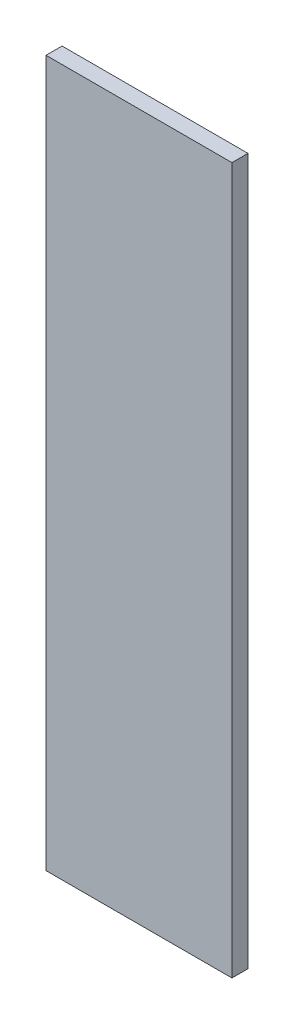
ISO-10303-21;
HEADER;
FILE_DESCRIPTION(('STEP AP214'),'2;1');
FILE_NAME('part.step','',(''),(''),'','','');
FILE_SCHEMA(('AUTOMOTIVE_DESIGN { 1 0 10303 214 1 1 1 1 }'));
ENDSEC;
DATA;
#1=APPLICATION_CONTEXT('core data for automotive mechanical design processes');
#2=APPLICATION_PROTOCOL_DEFINITION('international standard','automotive_design',2000,#1);
#3=PRODUCT_CONTEXT('',#1,'mechanical');
#4=PRODUCT('Part','Part','',(#3));
#5=PRODUCT_RELATED_PRODUCT_CATEGORY('part','',(#4));
#6=PRODUCT_DEFINITION_FORMATION('','',#4);
#7=PRODUCT_DEFINITION_CONTEXT('part definition',#1,'design');
#8=PRODUCT_DEFINITION('design','',#6,#7);
#9=PRODUCT_DEFINITION_SHAPE('','',#8);
#10=(LENGTH_UNIT() NAMED_UNIT(*) SI_UNIT(.MILLI.,.METRE.));
#11=(NAMED_UNIT(*) PLANE_ANGLE_UNIT() SI_UNIT($,.RADIAN.));
#12=(NAMED_UNIT(*) SI_UNIT($,.STERADIAN.) SOLID_ANGLE_UNIT());
#13=UNCERTAINTY_MEASURE_WITH_UNIT(LENGTH_MEASURE(1.E-05),#10,'distance_accuracy_value','');
#14=(GEOMETRIC_REPRESENTATION_CONTEXT(3) GLOBAL_UNCERTAINTY_ASSIGNED_CONTEXT((#13)) GLOBAL_UNIT_ASSIGNED_CONTEXT((#10,
#11,#12)) REPRESENTATION_CONTEXT('',''));
#15=CARTESIAN_POINT('',(0.,0.,0.));
#16=DIRECTION('',(0.,0.,1.));
#17=DIRECTION('',(1.,0.,0.));
#18=AXIS2_PLACEMENT_3D('',#15,#16,#17);
#19=CARTESIAN_POINT('',(0.,0.,19.05));
#20=DIRECTION('',(1.,0.,0.));
#21=DIRECTION('',(0.,0.,-1.));
#22=AXIS2_PLACEMENT_3D('',#19,#20,#21);
#23=PLANE('',#22);
#24=DIRECTION('',(0.,-1.,0.));
#25=VECTOR('',#24,1.);
#26=CARTESIAN_POINT('',(0.,0.,0.));
#27=LINE('',#26,#25);
#28=CARTESIAN_POINT('',(0.,838.2,0.));
#29=VERTEX_POINT('',#28);
#30=CARTESIAN_POINT('',(0.,0.,0.));
#31=VERTEX_POINT('',#30);
#32=EDGE_CURVE('E96',#29,#31,#27,.T.);
#33=ORIENTED_EDGE('',*,*,#32,.T.);
#34=DIRECTION('',(0.,0.,-1.));
#35=VECTOR('',#34,1.);
#36=CARTESIAN_POINT('',(0.,0.,19.05));
#37=LINE('',#36,#35);
#38=CARTESIAN_POINT('',(0.,0.,19.05));
#39=VERTEX_POINT('',#38);
#40=EDGE_CURVE('E11',#39,#31,#37,.T.);
#41=ORIENTED_EDGE('',*,*,#40,.F.);
#42=DIRECTION('',(0.,-1.,0.));
#43=VECTOR('',#42,1.);
#44=CARTESIAN_POINT('',(0.,0.,19.05));
#45=LINE('',#44,#43);
#46=CARTESIAN_POINT('',(0.,838.2,19.05));
#47=VERTEX_POINT('',#46);
#48=EDGE_CURVE('E84',#47,#39,#45,.T.);
#49=ORIENTED_EDGE('',*,*,#48,.F.);
#50=DIRECTION('',(0.,0.,-1.));
#51=VECTOR('',#50,1.);
#52=CARTESIAN_POINT('',(0.,838.2,19.05));
#53=LINE('',#52,#51);
#54=EDGE_CURVE('E92',#47,#29,#53,.T.);
#55=ORIENTED_EDGE('',*,*,#54,.T.);
#56=EDGE_LOOP('',(#33,#41,#49,#55));
#57=FACE_BOUND('',#56,.T.);
#58=ADVANCED_FACE('F33',(#57),#23,.F.);
#59=CARTESIAN_POINT('',(0.,0.,19.05));
#60=DIRECTION('',(0.,1.,0.));
#61=DIRECTION('',(0.,0.,1.));
#62=AXIS2_PLACEMENT_3D('',#59,#60,#61);
#63=PLANE('',#62);
#64=DIRECTION('',(1.,0.,0.));
#65=VECTOR('',#64,1.);
#66=CARTESIAN_POINT('',(0.,0.,0.));
#67=LINE('',#66,#65);
#68=CARTESIAN_POINT('',(220.726,0.,0.));
#69=VERTEX_POINT('',#68);
#70=EDGE_CURVE('E88',#31,#69,#67,.T.);
#71=ORIENTED_EDGE('',*,*,#70,.T.);
#72=DIRECTION('',(0.,0.,-1.));
#73=VECTOR('',#72,1.);
#74=CARTESIAN_POINT('',(220.726,0.,19.05));
#75=LINE('',#74,#73);
#76=CARTESIAN_POINT('',(220.726,0.,19.05));
#77=VERTEX_POINT('',#76);
#78=EDGE_CURVE('E41',#77,#69,#75,.T.);
#79=ORIENTED_EDGE('',*,*,#78,.F.);
#80=DIRECTION('',(1.,0.,0.));
#81=VECTOR('',#80,1.);
#82=CARTESIAN_POINT('',(0.,0.,19.05));
#83=LINE('',#82,#81);
#84=EDGE_CURVE('E79',#39,#77,#83,.T.);
#85=ORIENTED_EDGE('',*,*,#84,.F.);
#86=ORIENTED_EDGE('',*,*,#40,.T.);
#87=EDGE_LOOP('',(#71,#79,#85,#86));
#88=FACE_BOUND('',#87,.T.);
#89=ADVANCED_FACE('F87',(#88),#63,.F.);
#90=CARTESIAN_POINT('',(220.726,0.,19.05));
#91=DIRECTION('',(-1.,0.,0.));
#92=DIRECTION('',(0.,0.,1.));
#93=AXIS2_PLACEMENT_3D('',#90,#91,#92);
#94=PLANE('',#93);
#95=DIRECTION('',(0.,1.,0.));
#96=VECTOR('',#95,1.);
#97=CARTESIAN_POINT('',(220.726,0.,0.));
#98=LINE('',#97,#96);
#99=CARTESIAN_POINT('',(220.726,838.2,0.));
#100=VERTEX_POINT('',#99);
#101=EDGE_CURVE('E66',#69,#100,#98,.T.);
#102=ORIENTED_EDGE('',*,*,#101,.T.);
#103=DIRECTION('',(0.,0.,-1.));
#104=VECTOR('',#103,1.);
#105=CARTESIAN_POINT('',(220.726,838.2,19.05));
#106=LINE('',#105,#104);
#107=CARTESIAN_POINT('',(220.726,838.2,19.05));
#108=VERTEX_POINT('',#107);
#109=EDGE_CURVE('E89',#108,#100,#106,.T.);
#110=ORIENTED_EDGE('',*,*,#109,.F.);
#111=DIRECTION('',(0.,1.,0.));
#112=VECTOR('',#111,1.);
#113=CARTESIAN_POINT('',(220.726,0.,19.05));
#114=LINE('',#113,#112);
#115=EDGE_CURVE('E82',#77,#108,#114,.T.);
#116=ORIENTED_EDGE('',*,*,#115,.F.);
#117=ORIENTED_EDGE('',*,*,#78,.T.);
#118=EDGE_LOOP('',(#102,#110,#116,#117));
#119=FACE_BOUND('',#118,.T.);
#120=ADVANCED_FACE('F90',(#119),#94,.F.);
#121=CARTESIAN_POINT('',(0.,838.2,19.05));
#122=DIRECTION('',(0.,-1.,0.));
#123=DIRECTION('',(0.,0.,-1.));
#124=AXIS2_PLACEMENT_3D('',#121,#122,#123);
#125=PLANE('',#124);
#126=DIRECTION('',(-1.,0.,0.));
#127=VECTOR('',#126,1.);
#128=CARTESIAN_POINT('',(0.,838.2,0.));
#129=LINE('',#128,#127);
#130=EDGE_CURVE('E72',#100,#29,#129,.T.);
#131=ORIENTED_EDGE('',*,*,#130,.T.);
#132=ORIENTED_EDGE('',*,*,#54,.F.);
#133=DIRECTION('',(-1.,0.,0.));
#134=VECTOR('',#133,1.);
#135=CARTESIAN_POINT('',(0.,838.2,19.05));
#136=LINE('',#135,#134);
#137=EDGE_CURVE('E49',#108,#47,#136,.T.);
#138=ORIENTED_EDGE('',*,*,#137,.F.);
#139=ORIENTED_EDGE('',*,*,#109,.T.);
#140=EDGE_LOOP('',(#131,#132,#138,#139));
#141=FACE_BOUND('',#140,.T.);
#142=ADVANCED_FACE('F103',(#141),#125,.F.);
#143=CARTESIAN_POINT('',(0.,0.,19.05));
#144=DIRECTION('',(0.,0.,-1.));
#145=DIRECTION('',(-1.,0.,0.));
#146=AXIS2_PLACEMENT_3D('',#143,#144,#145);
#147=PLANE('',#146);
#148=ORIENTED_EDGE('',*,*,#48,.T.);
#149=ORIENTED_EDGE('',*,*,#84,.T.);
#150=ORIENTED_EDGE('',*,*,#115,.T.);
#151=ORIENTED_EDGE('',*,*,#137,.T.);
#152=EDGE_LOOP('',(#148,#149,#150,#151));
#153=FACE_BOUND('',#152,.T.);
#154=ADVANCED_FACE('F80',(#153),#147,.F.);
#155=CARTESIAN_POINT('',(0.,0.,0.));
#156=DIRECTION('',(0.,0.,-1.));
#157=DIRECTION('',(-1.,0.,0.));
#158=AXIS2_PLACEMENT_3D('',#155,#156,#157);
#159=PLANE('',#158);
#160=ORIENTED_EDGE('',*,*,#32,.F.);
#161=ORIENTED_EDGE('',*,*,#130,.F.);
#162=ORIENTED_EDGE('',*,*,#101,.F.);
#163=ORIENTED_EDGE('',*,*,#70,.F.);
#164=EDGE_LOOP('',(#160,#161,#162,#163));
#165=FACE_BOUND('',#164,.T.);
#166=ADVANCED_FACE('F106',(#165),#159,.T.);
#167=CLOSED_SHELL('',(#58,#89,#120,#142,#154,#166));
#168=MANIFOLD_SOLID_BREP('B2',#167);
#169=ADVANCED_BREP_SHAPE_REPRESENTATION('',(#18,#168),#14);
#170=SHAPE_DEFINITION_REPRESENTATION(#9,#169);
ENDSEC;
END-ISO-10303-21;
